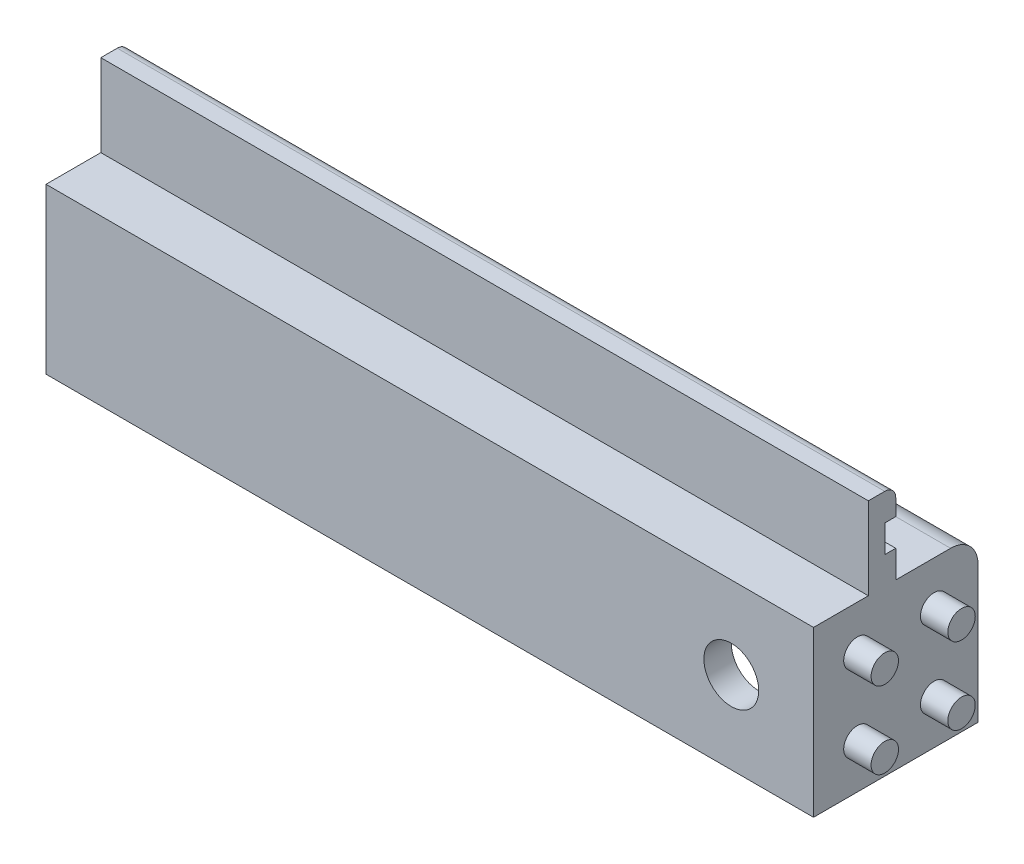
ISO-10303-21;
HEADER;
FILE_DESCRIPTION(('STEP AP214'),'2;1');
FILE_NAME('part.step','',(''),(''),'','','');
FILE_SCHEMA(('AUTOMOTIVE_DESIGN { 1 0 10303 214 1 1 1 1 }'));
ENDSEC;
DATA;
#1=APPLICATION_CONTEXT('core data for automotive mechanical design processes');
#2=APPLICATION_PROTOCOL_DEFINITION('international standard','automotive_design',2000,#1);
#3=PRODUCT_CONTEXT('',#1,'mechanical');
#4=PRODUCT('Part','Part','',(#3));
#5=PRODUCT_RELATED_PRODUCT_CATEGORY('part','',(#4));
#6=PRODUCT_DEFINITION_FORMATION('','',#4);
#7=PRODUCT_DEFINITION_CONTEXT('part definition',#1,'design');
#8=PRODUCT_DEFINITION('design','',#6,#7);
#9=PRODUCT_DEFINITION_SHAPE('','',#8);
#10=(LENGTH_UNIT() NAMED_UNIT(*) SI_UNIT(.MILLI.,.METRE.));
#11=(NAMED_UNIT(*) PLANE_ANGLE_UNIT() SI_UNIT($,.RADIAN.));
#12=(NAMED_UNIT(*) SI_UNIT($,.STERADIAN.) SOLID_ANGLE_UNIT());
#13=UNCERTAINTY_MEASURE_WITH_UNIT(LENGTH_MEASURE(1.E-05),#10,'distance_accuracy_value','');
#14=(GEOMETRIC_REPRESENTATION_CONTEXT(3) GLOBAL_UNCERTAINTY_ASSIGNED_CONTEXT((#13)) GLOBAL_UNIT_ASSIGNED_CONTEXT((#10,
#11,#12)) REPRESENTATION_CONTEXT('',''));
#15=CARTESIAN_POINT('',(0.,0.,0.));
#16=DIRECTION('',(0.,0.,1.));
#17=DIRECTION('',(1.,0.,0.));
#18=AXIS2_PLACEMENT_3D('',#15,#16,#17);
#19=CARTESIAN_POINT('',(0.,30.,0.));
#20=DIRECTION('',(0.,1.,0.));
#21=DIRECTION('',(0.,0.,1.));
#22=AXIS2_PLACEMENT_3D('',#19,#20,#21);
#23=PLANE('',#22);
#24=DIRECTION('',(0.,0.,-1.));
#25=VECTOR('',#24,1.);
#26=CARTESIAN_POINT('',(140.,30.,0.));
#27=LINE('',#26,#25);
#28=CARTESIAN_POINT('',(140.,30.,-15.));
#29=VERTEX_POINT('',#28);
#30=CARTESIAN_POINT('',(140.,30.,-25.));
#31=VERTEX_POINT('',#30);
#32=EDGE_CURVE('E328',#29,#31,#27,.T.);
#33=ORIENTED_EDGE('',*,*,#32,.T.);
#34=DIRECTION('',(-1.,0.,0.));
#35=VECTOR('',#34,1.);
#36=CARTESIAN_POINT('',(0.,30.,-25.));
#37=LINE('',#36,#35);
#38=CARTESIAN_POINT('',(0.,30.,-25.));
#39=VERTEX_POINT('',#38);
#40=EDGE_CURVE('E373',#31,#39,#37,.T.);
#41=ORIENTED_EDGE('',*,*,#40,.T.);
#42=DIRECTION('',(0.,0.,1.));
#43=VECTOR('',#42,1.);
#44=CARTESIAN_POINT('',(0.,30.,-30.));
#45=LINE('',#44,#43);
#46=CARTESIAN_POINT('',(0.,30.,-15.));
#47=VERTEX_POINT('',#46);
#48=EDGE_CURVE('E323',#39,#47,#45,.T.);
#49=ORIENTED_EDGE('',*,*,#48,.T.);
#50=DIRECTION('',(-1.,0.,0.));
#51=VECTOR('',#50,1.);
#52=CARTESIAN_POINT('',(0.,30.,-15.));
#53=LINE('',#52,#51);
#54=EDGE_CURVE('E220',#29,#47,#53,.T.);
#55=ORIENTED_EDGE('',*,*,#54,.F.);
#56=EDGE_LOOP('',(#33,#41,#49,#55));
#57=FACE_BOUND('',#56,.T.);
#58=ADVANCED_FACE('F33',(#57),#23,.T.);
#59=CARTESIAN_POINT('',(0.,30.,-5.));
#60=DIRECTION('',(0.,0.,-1.));
#61=DIRECTION('',(-1.,0.,0.));
#62=AXIS2_PLACEMENT_3D('',#59,#60,#61);
#63=PLANE('',#62);
#64=DIRECTION('',(1.,0.,0.));
#65=VECTOR('',#64,1.);
#66=CARTESIAN_POINT('',(0.,25.,-5.));
#67=LINE('',#66,#65);
#68=CARTESIAN_POINT('',(5.,25.,-5.));
#69=VERTEX_POINT('',#68);
#70=CARTESIAN_POINT('',(50.,25.,-5.));
#71=VERTEX_POINT('',#70);
#72=EDGE_CURVE('E302',#69,#71,#67,.T.);
#73=ORIENTED_EDGE('',*,*,#72,.T.);
#74=DIRECTION('',(0.,1.,0.));
#75=VECTOR('',#74,1.);
#76=CARTESIAN_POINT('',(50.,0.,-5.));
#77=LINE('',#76,#75);
#78=CARTESIAN_POINT('',(50.,0.,-5.));
#79=VERTEX_POINT('',#78);
#80=EDGE_CURVE('E281',#79,#71,#77,.T.);
#81=ORIENTED_EDGE('',*,*,#80,.F.);
#82=DIRECTION('',(1.,0.,0.));
#83=VECTOR('',#82,1.);
#84=CARTESIAN_POINT('',(0.,0.,-5.));
#85=LINE('',#84,#83);
#86=CARTESIAN_POINT('',(5.,0.,-5.));
#87=VERTEX_POINT('',#86);
#88=EDGE_CURVE('E320',#87,#79,#85,.T.);
#89=ORIENTED_EDGE('',*,*,#88,.F.);
#90=DIRECTION('',(0.,-1.,0.));
#91=VECTOR('',#90,1.);
#92=CARTESIAN_POINT('',(5.,30.,-5.));
#93=LINE('',#92,#91);
#94=EDGE_CURVE('E285',#69,#87,#93,.T.);
#95=ORIENTED_EDGE('',*,*,#94,.F.);
#96=EDGE_LOOP('',(#73,#81,#89,#95));
#97=FACE_BOUND('',#96,.T.);
#98=ADVANCED_FACE('F399',(#97),#63,.T.);
#99=CARTESIAN_POINT('',(125.,15.,-5.));
#100=DIRECTION('',(0.,0.,-1.));
#101=DIRECTION('',(-1.,0.,0.));
#102=AXIS2_PLACEMENT_3D('',#99,#100,#101);
#103=CIRCLE('',#102,4.99999999999999);
#104=CARTESIAN_POINT('',(120.,15.,-5.));
#105=VERTEX_POINT('',#104);
#106=EDGE_CURVE('E246',#105,#105,#103,.T.);
#107=ORIENTED_EDGE('',*,*,#106,.F.);
#108=EDGE_LOOP('',(#107));
#109=FACE_BOUND('',#108,.T.);
#110=CARTESIAN_POINT('',(55.,0.,-5.));
#111=VERTEX_POINT('',#110);
#112=CARTESIAN_POINT('',(135.,0.,-5.));
#113=VERTEX_POINT('',#112);
#114=EDGE_CURVE('E313',#111,#113,#85,.T.);
#115=ORIENTED_EDGE('',*,*,#114,.F.);
#116=DIRECTION('',(0.,1.,0.));
#117=VECTOR('',#116,1.);
#118=CARTESIAN_POINT('',(55.,0.,-5.));
#119=LINE('',#118,#117);
#120=CARTESIAN_POINT('',(55.,25.,-5.));
#121=VERTEX_POINT('',#120);
#122=EDGE_CURVE('E269',#111,#121,#119,.T.);
#123=ORIENTED_EDGE('',*,*,#122,.T.);
#124=CARTESIAN_POINT('',(135.,25.,-5.));
#125=VERTEX_POINT('',#124);
#126=EDGE_CURVE('E293',#121,#125,#67,.T.);
#127=ORIENTED_EDGE('',*,*,#126,.T.);
#128=DIRECTION('',(0.,-1.,0.));
#129=VECTOR('',#128,1.);
#130=CARTESIAN_POINT('',(135.,30.,-5.));
#131=LINE('',#130,#129);
#132=EDGE_CURVE('E289',#125,#113,#131,.T.);
#133=ORIENTED_EDGE('',*,*,#132,.T.);
#134=EDGE_LOOP('',(#115,#123,#127,#133));
#135=FACE_BOUND('',#134,.T.);
#136=ADVANCED_FACE('F407',(#109,#135),#63,.T.);
#137=CARTESIAN_POINT('',(140.,30.,-25.));
#138=DIRECTION('',(0.,0.,1.));
#139=DIRECTION('',(1.,0.,0.));
#140=AXIS2_PLACEMENT_3D('',#137,#138,#139);
#141=PLANE('',#140);
#142=DIRECTION('',(-1.,0.,0.));
#143=VECTOR('',#142,1.);
#144=CARTESIAN_POINT('',(140.,0.,-25.));
#145=LINE('',#144,#143);
#146=CARTESIAN_POINT('',(50.,0.,-25.));
#147=VERTEX_POINT('',#146);
#148=CARTESIAN_POINT('',(5.,0.,-25.));
#149=VERTEX_POINT('',#148);
#150=EDGE_CURVE('E316',#147,#149,#145,.T.);
#151=ORIENTED_EDGE('',*,*,#150,.F.);
#152=DIRECTION('',(0.,1.,0.));
#153=VECTOR('',#152,1.);
#154=CARTESIAN_POINT('',(50.,0.,-25.));
#155=LINE('',#154,#153);
#156=CARTESIAN_POINT('',(50.,25.,-25.));
#157=VERTEX_POINT('',#156);
#158=EDGE_CURVE('E279',#147,#157,#155,.T.);
#159=ORIENTED_EDGE('',*,*,#158,.T.);
#160=DIRECTION('',(-1.,0.,0.));
#161=VECTOR('',#160,1.);
#162=CARTESIAN_POINT('',(140.,25.,-25.));
#163=LINE('',#162,#161);
#164=CARTESIAN_POINT('',(5.,25.,-25.));
#165=VERTEX_POINT('',#164);
#166=EDGE_CURVE('E308',#157,#165,#163,.T.);
#167=ORIENTED_EDGE('',*,*,#166,.T.);
#168=DIRECTION('',(0.,-1.,0.));
#169=VECTOR('',#168,1.);
#170=CARTESIAN_POINT('',(5.,30.,-25.));
#171=LINE('',#170,#169);
#172=EDGE_CURVE('E295',#165,#149,#171,.T.);
#173=ORIENTED_EDGE('',*,*,#172,.T.);
#174=EDGE_LOOP('',(#151,#159,#167,#173));
#175=FACE_BOUND('',#174,.T.);
#176=ADVANCED_FACE('F540',(#175),#141,.T.);
#177=CARTESIAN_POINT('',(125.,15.,-25.));
#178=DIRECTION('',(0.,0.,1.));
#179=DIRECTION('',(1.,0.,0.));
#180=AXIS2_PLACEMENT_3D('',#177,#178,#179);
#181=CIRCLE('',#180,4.99999999999999);
#182=CARTESIAN_POINT('',(130.,15.,-25.));
#183=VERTEX_POINT('',#182);
#184=EDGE_CURVE('E243',#183,#183,#181,.T.);
#185=ORIENTED_EDGE('',*,*,#184,.F.);
#186=EDGE_LOOP('',(#185));
#187=FACE_BOUND('',#186,.T.);
#188=CARTESIAN_POINT('',(135.,25.,-25.));
#189=VERTEX_POINT('',#188);
#190=CARTESIAN_POINT('',(55.,25.,-25.));
#191=VERTEX_POINT('',#190);
#192=EDGE_CURVE('E299',#189,#191,#163,.T.);
#193=ORIENTED_EDGE('',*,*,#192,.T.);
#194=DIRECTION('',(0.,1.,0.));
#195=VECTOR('',#194,1.);
#196=CARTESIAN_POINT('',(55.,0.,-25.));
#197=LINE('',#196,#195);
#198=CARTESIAN_POINT('',(55.,0.,-25.));
#199=VERTEX_POINT('',#198);
#200=EDGE_CURVE('E276',#199,#191,#197,.T.);
#201=ORIENTED_EDGE('',*,*,#200,.F.);
#202=CARTESIAN_POINT('',(135.,0.,-25.));
#203=VERTEX_POINT('',#202);
#204=EDGE_CURVE('E294',#203,#199,#145,.T.);
#205=ORIENTED_EDGE('',*,*,#204,.F.);
#206=DIRECTION('',(0.,-1.,0.));
#207=VECTOR('',#206,1.);
#208=CARTESIAN_POINT('',(135.,30.,-25.));
#209=LINE('',#208,#207);
#210=EDGE_CURVE('E298',#189,#203,#209,.T.);
#211=ORIENTED_EDGE('',*,*,#210,.F.);
#212=EDGE_LOOP('',(#193,#201,#205,#211));
#213=FACE_BOUND('',#212,.T.);
#214=ADVANCED_FACE('F542',(#187,#213),#141,.T.);
#215=CARTESIAN_POINT('',(0.,25.,0.));
#216=DIRECTION('',(0.,1.,0.));
#217=DIRECTION('',(0.,0.,1.));
#218=AXIS2_PLACEMENT_3D('',#215,#216,#217);
#219=PLANE('',#218);
#220=DIRECTION('',(0.,0.,-1.));
#221=VECTOR('',#220,1.);
#222=CARTESIAN_POINT('',(50.,25.,-5.));
#223=LINE('',#222,#221);
#224=EDGE_CURVE('E261',#71,#157,#223,.T.);
#225=ORIENTED_EDGE('',*,*,#224,.F.);
#226=ORIENTED_EDGE('',*,*,#72,.F.);
#227=DIRECTION('',(0.,0.,1.));
#228=VECTOR('',#227,1.);
#229=CARTESIAN_POINT('',(5.,25.,-30.));
#230=LINE('',#229,#228);
#231=EDGE_CURVE('E290',#165,#69,#230,.T.);
#232=ORIENTED_EDGE('',*,*,#231,.F.);
#233=ORIENTED_EDGE('',*,*,#166,.F.);
#234=EDGE_LOOP('',(#225,#226,#232,#233));
#235=FACE_BOUND('',#234,.T.);
#236=ADVANCED_FACE('F544',(#235),#219,.F.);
#237=DIRECTION('',(0.,0.,1.));
#238=VECTOR('',#237,1.);
#239=CARTESIAN_POINT('',(55.,25.,-25.));
#240=LINE('',#239,#238);
#241=EDGE_CURVE('E266',#191,#121,#240,.T.);
#242=ORIENTED_EDGE('',*,*,#241,.F.);
#243=ORIENTED_EDGE('',*,*,#192,.F.);
#244=DIRECTION('',(0.,0.,-1.));
#245=VECTOR('',#244,1.);
#246=CARTESIAN_POINT('',(135.,25.,0.));
#247=LINE('',#246,#245);
#248=EDGE_CURVE('E305',#125,#189,#247,.T.);
#249=ORIENTED_EDGE('',*,*,#248,.F.);
#250=ORIENTED_EDGE('',*,*,#126,.F.);
#251=EDGE_LOOP('',(#242,#243,#249,#250));
#252=FACE_BOUND('',#251,.T.);
#253=ADVANCED_FACE('F456',(#252),#219,.F.);
#254=CARTESIAN_POINT('',(0.,30.,-30.));
#255=DIRECTION('',(1.,0.,0.));
#256=DIRECTION('',(0.,0.,-1.));
#257=AXIS2_PLACEMENT_3D('',#254,#255,#256);
#258=PLANE('',#257);
#259=CARTESIAN_POINT('',(0.,15.,-15.));
#260=DIRECTION('',(-1.,0.,0.));
#261=DIRECTION('',(0.,0.,1.));
#262=AXIS2_PLACEMENT_3D('',#259,#260,#261);
#263=CIRCLE('',#262,5.2);
#264=CARTESIAN_POINT('',(0.,15.,-9.8));
#265=VERTEX_POINT('',#264);
#266=EDGE_CURVE('E805',#265,#265,#263,.T.);
#267=ORIENTED_EDGE('',*,*,#266,.F.);
#268=EDGE_LOOP('',(#267));
#269=FACE_BOUND('',#268,.T.);
#270=ORIENTED_EDGE('',*,*,#48,.F.);
#271=CARTESIAN_POINT('',(0.,25.,-25.));
#272=DIRECTION('',(1.,0.,0.));
#273=DIRECTION('',(0.,0.,-1.));
#274=AXIS2_PLACEMENT_3D('',#271,#272,#273);
#275=CIRCLE('',#274,5.);
#276=CARTESIAN_POINT('',(0.,25.,-30.));
#277=VERTEX_POINT('',#276);
#278=EDGE_CURVE('E55',#39,#277,#275,.F.);
#279=ORIENTED_EDGE('',*,*,#278,.T.);
#280=DIRECTION('',(0.,-1.,0.));
#281=VECTOR('',#280,1.);
#282=CARTESIAN_POINT('',(0.,30.,-30.));
#283=LINE('',#282,#281);
#284=CARTESIAN_POINT('',(0.,0.,-30.));
#285=VERTEX_POINT('',#284);
#286=EDGE_CURVE('E331',#277,#285,#283,.T.);
#287=ORIENTED_EDGE('',*,*,#286,.T.);
#288=DIRECTION('',(0.,0.,1.));
#289=VECTOR('',#288,1.);
#290=CARTESIAN_POINT('',(0.,0.,-30.));
#291=LINE('',#290,#289);
#292=CARTESIAN_POINT('',(0.,0.,0.));
#293=VERTEX_POINT('',#292);
#294=EDGE_CURVE('E288',#285,#293,#291,.T.);
#295=ORIENTED_EDGE('',*,*,#294,.T.);
#296=DIRECTION('',(0.,-1.,0.));
#297=VECTOR('',#296,1.);
#298=CARTESIAN_POINT('',(0.,30.,0.));
#299=LINE('',#298,#297);
#300=CARTESIAN_POINT('',(0.,30.,0.));
#301=VERTEX_POINT('',#300);
#302=EDGE_CURVE('E348',#301,#293,#299,.T.);
#303=ORIENTED_EDGE('',*,*,#302,.F.);
#304=CARTESIAN_POINT('',(0.,30.,-10.));
#305=VERTEX_POINT('',#304);
#306=EDGE_CURVE('E326',#305,#301,#45,.T.);
#307=ORIENTED_EDGE('',*,*,#306,.F.);
#308=DIRECTION('',(0.,-1.,0.));
#309=VECTOR('',#308,1.);
#310=CARTESIAN_POINT('',(0.,45.,-10.));
#311=LINE('',#310,#309);
#312=CARTESIAN_POINT('',(0.,45.,-10.));
#313=VERTEX_POINT('',#312);
#314=EDGE_CURVE('E236',#313,#305,#311,.T.);
#315=ORIENTED_EDGE('',*,*,#314,.F.);
#316=DIRECTION('',(0.,0.,1.));
#317=VECTOR('',#316,1.);
#318=CARTESIAN_POINT('',(0.,45.,-15.));
#319=LINE('',#318,#317);
#320=CARTESIAN_POINT('',(0.,45.,-13.));
#321=VERTEX_POINT('',#320);
#322=EDGE_CURVE('E217',#321,#313,#319,.T.);
#323=ORIENTED_EDGE('',*,*,#322,.F.);
#324=CARTESIAN_POINT('',(0.,43.,-13.));
#325=DIRECTION('',(1.,0.,0.));
#326=DIRECTION('',(0.,0.,-1.));
#327=AXIS2_PLACEMENT_3D('',#324,#325,#326);
#328=CIRCLE('',#327,2.);
#329=CARTESIAN_POINT('',(0.,43.,-15.));
#330=VERTEX_POINT('',#329);
#331=EDGE_CURVE('E368',#321,#330,#328,.F.);
#332=ORIENTED_EDGE('',*,*,#331,.T.);
#333=DIRECTION('',(0.,-1.,0.));
#334=VECTOR('',#333,1.);
#335=CARTESIAN_POINT('',(0.,45.,-15.));
#336=LINE('',#335,#334);
#337=EDGE_CURVE('E225',#330,#47,#336,.T.);
#338=ORIENTED_EDGE('',*,*,#337,.T.);
#339=EDGE_LOOP('',(#270,#279,#287,#295,#303,#307,#315,#323,#332,#338));
#340=FACE_BOUND('',#339,.T.);
#341=ADVANCED_FACE('F387',(#269,#340),#258,.F.);
#342=CARTESIAN_POINT('',(0.,30.,0.));
#343=DIRECTION('',(0.,0.,-1.));
#344=DIRECTION('',(-1.,0.,0.));
#345=AXIS2_PLACEMENT_3D('',#342,#343,#344);
#346=PLANE('',#345);
#347=CARTESIAN_POINT('',(125.,15.,0.));
#348=DIRECTION('',(0.,0.,-1.));
#349=DIRECTION('',(-1.,0.,0.));
#350=AXIS2_PLACEMENT_3D('',#347,#348,#349);
#351=CIRCLE('',#350,4.99999999999999);
#352=CARTESIAN_POINT('',(120.,15.,0.));
#353=VERTEX_POINT('',#352);
#354=EDGE_CURVE('E239',#353,#353,#351,.T.);
#355=ORIENTED_EDGE('',*,*,#354,.T.);
#356=EDGE_LOOP('',(#355));
#357=FACE_BOUND('',#356,.T.);
#358=DIRECTION('',(1.,0.,0.));
#359=VECTOR('',#358,1.);
#360=CARTESIAN_POINT('',(0.,0.,0.));
#361=LINE('',#360,#359);
#362=CARTESIAN_POINT('',(140.,0.,0.));
#363=VERTEX_POINT('',#362);
#364=EDGE_CURVE('E334',#293,#363,#361,.T.);
#365=ORIENTED_EDGE('',*,*,#364,.T.);
#366=DIRECTION('',(0.,-1.,0.));
#367=VECTOR('',#366,1.);
#368=CARTESIAN_POINT('',(140.,30.,0.));
#369=LINE('',#368,#367);
#370=CARTESIAN_POINT('',(140.,30.,0.));
#371=VERTEX_POINT('',#370);
#372=EDGE_CURVE('E345',#371,#363,#369,.T.);
#373=ORIENTED_EDGE('',*,*,#372,.F.);
#374=DIRECTION('',(1.,0.,0.));
#375=VECTOR('',#374,1.);
#376=CARTESIAN_POINT('',(0.,30.,0.));
#377=LINE('',#376,#375);
#378=EDGE_CURVE('E325',#301,#371,#377,.T.);
#379=ORIENTED_EDGE('',*,*,#378,.F.);
#380=ORIENTED_EDGE('',*,*,#302,.T.);
#381=EDGE_LOOP('',(#365,#373,#379,#380));
#382=FACE_BOUND('',#381,.T.);
#383=ADVANCED_FACE('F446',(#357,#382),#346,.F.);
#384=CARTESIAN_POINT('',(140.,30.,0.));
#385=DIRECTION('',(-1.,0.,0.));
#386=DIRECTION('',(0.,0.,1.));
#387=AXIS2_PLACEMENT_3D('',#384,#385,#386);
#388=PLANE('',#387);
#389=DIRECTION('',(0.,-1.,0.));
#390=VECTOR('',#389,1.);
#391=CARTESIAN_POINT('',(140.,30.,-30.));
#392=LINE('',#391,#390);
#393=CARTESIAN_POINT('',(140.,25.,-30.));
#394=VERTEX_POINT('',#393);
#395=CARTESIAN_POINT('',(140.,0.,-30.));
#396=VERTEX_POINT('',#395);
#397=EDGE_CURVE('E343',#394,#396,#392,.T.);
#398=ORIENTED_EDGE('',*,*,#397,.F.);
#399=CARTESIAN_POINT('',(140.,25.,-25.));
#400=DIRECTION('',(-1.,0.,0.));
#401=DIRECTION('',(0.,0.,1.));
#402=AXIS2_PLACEMENT_3D('',#399,#400,#401);
#403=CIRCLE('',#402,5.);
#404=EDGE_CURVE('E11',#394,#31,#403,.F.);
#405=ORIENTED_EDGE('',*,*,#404,.T.);
#406=ORIENTED_EDGE('',*,*,#32,.F.);
#407=DIRECTION('',(0.,-1.,0.));
#408=VECTOR('',#407,1.);
#409=CARTESIAN_POINT('',(140.,45.,-15.));
#410=LINE('',#409,#408);
#411=CARTESIAN_POINT('',(140.,35.,-15.));
#412=VERTEX_POINT('',#411);
#413=EDGE_CURVE('E192',#412,#29,#410,.T.);
#414=ORIENTED_EDGE('',*,*,#413,.F.);
#415=DIRECTION('',(0.,0.,1.));
#416=VECTOR('',#415,1.);
#417=CARTESIAN_POINT('',(140.,35.,-15.));
#418=LINE('',#417,#416);
#419=CARTESIAN_POINT('',(140.,35.,-13.));
#420=VERTEX_POINT('',#419);
#421=EDGE_CURVE('E229',#412,#420,#418,.T.);
#422=ORIENTED_EDGE('',*,*,#421,.T.);
#423=DIRECTION('',(0.,1.,0.));
#424=VECTOR('',#423,1.);
#425=CARTESIAN_POINT('',(140.,40.,-13.));
#426=LINE('',#425,#424);
#427=CARTESIAN_POINT('',(140.,40.,-13.));
#428=VERTEX_POINT('',#427);
#429=EDGE_CURVE('E208',#420,#428,#426,.T.);
#430=ORIENTED_EDGE('',*,*,#429,.T.);
#431=DIRECTION('',(0.,0.,1.));
#432=VECTOR('',#431,1.);
#433=CARTESIAN_POINT('',(140.,40.,-15.));
#434=LINE('',#433,#432);
#435=CARTESIAN_POINT('',(140.,40.,-15.));
#436=VERTEX_POINT('',#435);
#437=EDGE_CURVE('E198',#436,#428,#434,.T.);
#438=ORIENTED_EDGE('',*,*,#437,.F.);
#439=CARTESIAN_POINT('',(140.,43.,-15.));
#440=VERTEX_POINT('',#439);
#441=EDGE_CURVE('E180',#440,#436,#410,.T.);
#442=ORIENTED_EDGE('',*,*,#441,.F.);
#443=CARTESIAN_POINT('',(140.,43.,-13.));
#444=DIRECTION('',(-1.,0.,0.));
#445=DIRECTION('',(0.,0.,1.));
#446=AXIS2_PLACEMENT_3D('',#443,#444,#445);
#447=CIRCLE('',#446,2.);
#448=CARTESIAN_POINT('',(140.,45.,-13.));
#449=VERTEX_POINT('',#448);
#450=EDGE_CURVE('E371',#440,#449,#447,.F.);
#451=ORIENTED_EDGE('',*,*,#450,.T.);
#452=DIRECTION('',(0.,0.,-1.));
#453=VECTOR('',#452,1.);
#454=CARTESIAN_POINT('',(140.,45.,-15.));
#455=LINE('',#454,#453);
#456=CARTESIAN_POINT('',(140.,45.,-10.));
#457=VERTEX_POINT('',#456);
#458=EDGE_CURVE('E222',#457,#449,#455,.T.);
#459=ORIENTED_EDGE('',*,*,#458,.F.);
#460=DIRECTION('',(0.,-1.,0.));
#461=VECTOR('',#460,1.);
#462=CARTESIAN_POINT('',(140.,45.,-10.));
#463=LINE('',#462,#461);
#464=CARTESIAN_POINT('',(140.,30.,-10.));
#465=VERTEX_POINT('',#464);
#466=EDGE_CURVE('E191',#457,#465,#463,.T.);
#467=ORIENTED_EDGE('',*,*,#466,.T.);
#468=EDGE_CURVE('E329',#371,#465,#27,.T.);
#469=ORIENTED_EDGE('',*,*,#468,.F.);
#470=ORIENTED_EDGE('',*,*,#372,.T.);
#471=DIRECTION('',(0.,0.,-1.));
#472=VECTOR('',#471,1.);
#473=CARTESIAN_POINT('',(140.,0.,0.));
#474=LINE('',#473,#472);
#475=EDGE_CURVE('E336',#363,#396,#474,.T.);
#476=ORIENTED_EDGE('',*,*,#475,.T.);
#477=EDGE_LOOP('',(#398,#405,#406,#414,#422,#430,#438,#442,#451,#459,#467,#469,#470,#476));
#478=FACE_BOUND('',#477,.T.);
#479=CARTESIAN_POINT('',(140.,8.,-22.));
#480=DIRECTION('',(-1.,0.,0.));
#481=DIRECTION('',(0.,0.,1.));
#482=AXIS2_PLACEMENT_3D('',#479,#480,#481);
#483=CIRCLE('',#482,2.5);
#484=CARTESIAN_POINT('',(140.,8.,-19.5));
#485=VERTEX_POINT('',#484);
#486=EDGE_CURVE('E360',#485,#485,#483,.F.);
#487=ORIENTED_EDGE('',*,*,#486,.F.);
#488=EDGE_LOOP('',(#487));
#489=FACE_BOUND('',#488,.T.);
#490=CARTESIAN_POINT('',(140.,8.,-8.));
#491=DIRECTION('',(-1.,0.,0.));
#492=DIRECTION('',(0.,0.,1.));
#493=AXIS2_PLACEMENT_3D('',#490,#491,#492);
#494=CIRCLE('',#493,2.5);
#495=CARTESIAN_POINT('',(140.,8.,-5.5));
#496=VERTEX_POINT('',#495);
#497=EDGE_CURVE('E357',#496,#496,#494,.F.);
#498=ORIENTED_EDGE('',*,*,#497,.F.);
#499=EDGE_LOOP('',(#498));
#500=FACE_BOUND('',#499,.T.);
#501=CARTESIAN_POINT('',(140.,22.,-22.));
#502=DIRECTION('',(-1.,0.,0.));
#503=DIRECTION('',(0.,0.,1.));
#504=AXIS2_PLACEMENT_3D('',#501,#502,#503);
#505=CIRCLE('',#504,2.5);
#506=CARTESIAN_POINT('',(140.,22.,-19.5));
#507=VERTEX_POINT('',#506);
#508=EDGE_CURVE('E354',#507,#507,#505,.F.);
#509=ORIENTED_EDGE('',*,*,#508,.F.);
#510=EDGE_LOOP('',(#509));
#511=FACE_BOUND('',#510,.T.);
#512=CARTESIAN_POINT('',(140.,22.,-8.));
#513=DIRECTION('',(-1.,0.,0.));
#514=DIRECTION('',(0.,0.,1.));
#515=AXIS2_PLACEMENT_3D('',#512,#513,#514);
#516=CIRCLE('',#515,2.5);
#517=CARTESIAN_POINT('',(140.,22.,-5.5));
#518=VERTEX_POINT('',#517);
#519=EDGE_CURVE('E351',#518,#518,#516,.F.);
#520=ORIENTED_EDGE('',*,*,#519,.F.);
#521=EDGE_LOOP('',(#520));
#522=FACE_BOUND('',#521,.T.);
#523=ADVANCED_FACE('F205',(#478,#489,#500,#511,#522),#388,.F.);
#524=CARTESIAN_POINT('',(140.,30.,-30.));
#525=DIRECTION('',(0.,0.,1.));
#526=DIRECTION('',(1.,0.,0.));
#527=AXIS2_PLACEMENT_3D('',#524,#525,#526);
#528=PLANE('',#527);
#529=CARTESIAN_POINT('',(125.,15.,-30.));
#530=DIRECTION('',(0.,0.,1.));
#531=DIRECTION('',(1.,0.,0.));
#532=AXIS2_PLACEMENT_3D('',#529,#530,#531);
#533=CIRCLE('',#532,4.99999999999999);
#534=CARTESIAN_POINT('',(130.,15.,-30.));
#535=VERTEX_POINT('',#534);
#536=EDGE_CURVE('E242',#535,#535,#533,.T.);
#537=ORIENTED_EDGE('',*,*,#536,.T.);
#538=EDGE_LOOP('',(#537));
#539=FACE_BOUND('',#538,.T.);
#540=ORIENTED_EDGE('',*,*,#286,.F.);
#541=DIRECTION('',(-1.,0.,0.));
#542=VECTOR('',#541,1.);
#543=CARTESIAN_POINT('',(140.,25.,-30.));
#544=LINE('',#543,#542);
#545=EDGE_CURVE('E41',#277,#394,#544,.F.);
#546=ORIENTED_EDGE('',*,*,#545,.T.);
#547=ORIENTED_EDGE('',*,*,#397,.T.);
#548=DIRECTION('',(-1.,0.,0.));
#549=VECTOR('',#548,1.);
#550=CARTESIAN_POINT('',(140.,0.,-30.));
#551=LINE('',#550,#549);
#552=EDGE_CURVE('E339',#396,#285,#551,.T.);
#553=ORIENTED_EDGE('',*,*,#552,.T.);
#554=EDGE_LOOP('',(#540,#546,#547,#553));
#555=FACE_BOUND('',#554,.T.);
#556=ADVANCED_FACE('F414',(#539,#555),#528,.F.);
#557=DIRECTION('',(1.,0.,0.));
#558=VECTOR('',#557,1.);
#559=CARTESIAN_POINT('',(0.,30.,-10.));
#560=LINE('',#559,#558);
#561=EDGE_CURVE('E226',#305,#465,#560,.T.);
#562=ORIENTED_EDGE('',*,*,#561,.F.);
#563=ORIENTED_EDGE('',*,*,#306,.T.);
#564=ORIENTED_EDGE('',*,*,#378,.T.);
#565=ORIENTED_EDGE('',*,*,#468,.T.);
#566=EDGE_LOOP('',(#562,#563,#564,#565));
#567=FACE_BOUND('',#566,.T.);
#568=ADVANCED_FACE('F401',(#567),#23,.T.);
#569=CARTESIAN_POINT('',(0.,0.,0.));
#570=DIRECTION('',(0.,1.,0.));
#571=DIRECTION('',(0.,0.,1.));
#572=AXIS2_PLACEMENT_3D('',#569,#570,#571);
#573=PLANE('',#572);
#574=ORIENTED_EDGE('',*,*,#88,.T.);
#575=DIRECTION('',(0.,0.,-1.));
#576=VECTOR('',#575,1.);
#577=CARTESIAN_POINT('',(50.,0.,-5.));
#578=LINE('',#577,#576);
#579=EDGE_CURVE('E262',#79,#147,#578,.T.);
#580=ORIENTED_EDGE('',*,*,#579,.T.);
#581=ORIENTED_EDGE('',*,*,#150,.T.);
#582=DIRECTION('',(0.,0.,1.));
#583=VECTOR('',#582,1.);
#584=CARTESIAN_POINT('',(5.,0.,-30.));
#585=LINE('',#584,#583);
#586=EDGE_CURVE('E284',#149,#87,#585,.T.);
#587=ORIENTED_EDGE('',*,*,#586,.T.);
#588=EDGE_LOOP('',(#574,#580,#581,#587));
#589=FACE_BOUND('',#588,.T.);
#590=ORIENTED_EDGE('',*,*,#204,.T.);
#591=DIRECTION('',(0.,0.,1.));
#592=VECTOR('',#591,1.);
#593=CARTESIAN_POINT('',(55.,0.,-25.));
#594=LINE('',#593,#592);
#595=EDGE_CURVE('E265',#199,#111,#594,.T.);
#596=ORIENTED_EDGE('',*,*,#595,.T.);
#597=ORIENTED_EDGE('',*,*,#114,.T.);
#598=DIRECTION('',(0.,0.,-1.));
#599=VECTOR('',#598,1.);
#600=CARTESIAN_POINT('',(135.,0.,0.));
#601=LINE('',#600,#599);
#602=EDGE_CURVE('E317',#113,#203,#601,.T.);
#603=ORIENTED_EDGE('',*,*,#602,.T.);
#604=EDGE_LOOP('',(#590,#596,#597,#603));
#605=FACE_BOUND('',#604,.T.);
#606=ORIENTED_EDGE('',*,*,#294,.F.);
#607=ORIENTED_EDGE('',*,*,#552,.F.);
#608=ORIENTED_EDGE('',*,*,#475,.F.);
#609=ORIENTED_EDGE('',*,*,#364,.F.);
#610=EDGE_LOOP('',(#606,#607,#608,#609));
#611=FACE_BOUND('',#610,.T.);
#612=ADVANCED_FACE('F413',(#589,#605,#611),#573,.F.);
#613=CARTESIAN_POINT('',(5.,30.,-30.));
#614=DIRECTION('',(1.,0.,0.));
#615=DIRECTION('',(0.,0.,-1.));
#616=AXIS2_PLACEMENT_3D('',#613,#614,#615);
#617=PLANE('',#616);
#618=CARTESIAN_POINT('',(5.,15.,-15.));
#619=DIRECTION('',(1.,0.,0.));
#620=DIRECTION('',(0.,0.,-1.));
#621=AXIS2_PLACEMENT_3D('',#618,#619,#620);
#622=CIRCLE('',#621,2.75);
#623=CARTESIAN_POINT('',(5.,15.,-17.75));
#624=VERTEX_POINT('',#623);
#625=EDGE_CURVE('E374',#624,#624,#622,.T.);
#626=ORIENTED_EDGE('',*,*,#625,.F.);
#627=EDGE_LOOP('',(#626));
#628=FACE_BOUND('',#627,.T.);
#629=ORIENTED_EDGE('',*,*,#586,.F.);
#630=ORIENTED_EDGE('',*,*,#172,.F.);
#631=ORIENTED_EDGE('',*,*,#231,.T.);
#632=ORIENTED_EDGE('',*,*,#94,.T.);
#633=EDGE_LOOP('',(#629,#630,#631,#632));
#634=FACE_BOUND('',#633,.T.);
#635=ADVANCED_FACE('F420',(#628,#634),#617,.T.);
#636=CARTESIAN_POINT('',(135.,30.,0.));
#637=DIRECTION('',(-1.,0.,0.));
#638=DIRECTION('',(0.,0.,1.));
#639=AXIS2_PLACEMENT_3D('',#636,#637,#638);
#640=PLANE('',#639);
#641=ORIENTED_EDGE('',*,*,#602,.F.);
#642=ORIENTED_EDGE('',*,*,#132,.F.);
#643=ORIENTED_EDGE('',*,*,#248,.T.);
#644=ORIENTED_EDGE('',*,*,#210,.T.);
#645=EDGE_LOOP('',(#641,#642,#643,#644));
#646=FACE_BOUND('',#645,.T.);
#647=ADVANCED_FACE('F532',(#646),#640,.T.);
#648=CARTESIAN_POINT('',(50.,0.,-5.));
#649=DIRECTION('',(1.,0.,0.));
#650=DIRECTION('',(0.,0.,-1.));
#651=AXIS2_PLACEMENT_3D('',#648,#649,#650);
#652=PLANE('',#651);
#653=ORIENTED_EDGE('',*,*,#224,.T.);
#654=ORIENTED_EDGE('',*,*,#158,.F.);
#655=ORIENTED_EDGE('',*,*,#579,.F.);
#656=ORIENTED_EDGE('',*,*,#80,.T.);
#657=EDGE_LOOP('',(#653,#654,#655,#656));
#658=FACE_BOUND('',#657,.T.);
#659=ADVANCED_FACE('F528',(#658),#652,.F.);
#660=CARTESIAN_POINT('',(55.,0.,-25.));
#661=DIRECTION('',(-1.,0.,0.));
#662=DIRECTION('',(0.,0.,1.));
#663=AXIS2_PLACEMENT_3D('',#660,#661,#662);
#664=PLANE('',#663);
#665=ORIENTED_EDGE('',*,*,#241,.T.);
#666=ORIENTED_EDGE('',*,*,#122,.F.);
#667=ORIENTED_EDGE('',*,*,#595,.F.);
#668=ORIENTED_EDGE('',*,*,#200,.T.);
#669=EDGE_LOOP('',(#665,#666,#667,#668));
#670=FACE_BOUND('',#669,.T.);
#671=ADVANCED_FACE('F524',(#670),#664,.F.);
#672=CARTESIAN_POINT('',(145.,22.,-8.));
#673=DIRECTION('',(-1.,0.,0.));
#674=DIRECTION('',(0.,0.,1.));
#675=AXIS2_PLACEMENT_3D('',#672,#673,#674);
#676=CYLINDRICAL_SURFACE('',#675,2.5);
#677=CARTESIAN_POINT('',(145.,22.,-8.));
#678=DIRECTION('',(1.,0.,0.));
#679=DIRECTION('',(0.,0.,-1.));
#680=AXIS2_PLACEMENT_3D('',#677,#678,#679);
#681=CIRCLE('',#680,2.5);
#682=CARTESIAN_POINT('',(145.,22.,-10.5));
#683=VERTEX_POINT('',#682);
#684=EDGE_CURVE('E258',#683,#683,#681,.T.);
#685=ORIENTED_EDGE('',*,*,#684,.F.);
#686=EDGE_LOOP('',(#685));
#687=FACE_BOUND('',#686,.T.);
#688=ORIENTED_EDGE('',*,*,#519,.T.);
#689=EDGE_LOOP('',(#688));
#690=FACE_BOUND('',#689,.T.);
#691=ADVANCED_FACE('F520',(#687,#690),#676,.T.);
#692=CARTESIAN_POINT('',(145.,22.,-8.));
#693=DIRECTION('',(1.,0.,0.));
#694=DIRECTION('',(0.,0.,-1.));
#695=AXIS2_PLACEMENT_3D('',#692,#693,#694);
#696=PLANE('',#695);
#697=ORIENTED_EDGE('',*,*,#684,.T.);
#698=EDGE_LOOP('',(#697));
#699=FACE_BOUND('',#698,.T.);
#700=ADVANCED_FACE('F516',(#699),#696,.T.);
#701=CARTESIAN_POINT('',(145.,22.,-22.));
#702=DIRECTION('',(-1.,0.,0.));
#703=DIRECTION('',(0.,0.,1.));
#704=AXIS2_PLACEMENT_3D('',#701,#702,#703);
#705=CYLINDRICAL_SURFACE('',#704,2.5);
#706=CARTESIAN_POINT('',(145.,22.,-22.));
#707=DIRECTION('',(1.,0.,0.));
#708=DIRECTION('',(0.,0.,-1.));
#709=AXIS2_PLACEMENT_3D('',#706,#707,#708);
#710=CIRCLE('',#709,2.5);
#711=CARTESIAN_POINT('',(145.,22.,-24.5));
#712=VERTEX_POINT('',#711);
#713=EDGE_CURVE('E255',#712,#712,#710,.T.);
#714=ORIENTED_EDGE('',*,*,#713,.F.);
#715=EDGE_LOOP('',(#714));
#716=FACE_BOUND('',#715,.T.);
#717=ORIENTED_EDGE('',*,*,#508,.T.);
#718=EDGE_LOOP('',(#717));
#719=FACE_BOUND('',#718,.T.);
#720=ADVANCED_FACE('F512',(#716,#719),#705,.T.);
#721=CARTESIAN_POINT('',(145.,22.,-22.));
#722=DIRECTION('',(1.,0.,0.));
#723=DIRECTION('',(0.,0.,-1.));
#724=AXIS2_PLACEMENT_3D('',#721,#722,#723);
#725=PLANE('',#724);
#726=ORIENTED_EDGE('',*,*,#713,.T.);
#727=EDGE_LOOP('',(#726));
#728=FACE_BOUND('',#727,.T.);
#729=ADVANCED_FACE('F508',(#728),#725,.T.);
#730=CARTESIAN_POINT('',(145.,8.,-8.));
#731=DIRECTION('',(-1.,0.,0.));
#732=DIRECTION('',(0.,0.,1.));
#733=AXIS2_PLACEMENT_3D('',#730,#731,#732);
#734=CYLINDRICAL_SURFACE('',#733,2.5);
#735=CARTESIAN_POINT('',(145.,8.,-8.));
#736=DIRECTION('',(1.,0.,0.));
#737=DIRECTION('',(0.,0.,-1.));
#738=AXIS2_PLACEMENT_3D('',#735,#736,#737);
#739=CIRCLE('',#738,2.5);
#740=CARTESIAN_POINT('',(145.,8.,-10.5));
#741=VERTEX_POINT('',#740);
#742=EDGE_CURVE('E252',#741,#741,#739,.T.);
#743=ORIENTED_EDGE('',*,*,#742,.F.);
#744=EDGE_LOOP('',(#743));
#745=FACE_BOUND('',#744,.T.);
#746=ORIENTED_EDGE('',*,*,#497,.T.);
#747=EDGE_LOOP('',(#746));
#748=FACE_BOUND('',#747,.T.);
#749=ADVANCED_FACE('F504',(#745,#748),#734,.T.);
#750=CARTESIAN_POINT('',(145.,8.,-8.));
#751=DIRECTION('',(1.,0.,0.));
#752=DIRECTION('',(0.,0.,-1.));
#753=AXIS2_PLACEMENT_3D('',#750,#751,#752);
#754=PLANE('',#753);
#755=ORIENTED_EDGE('',*,*,#742,.T.);
#756=EDGE_LOOP('',(#755));
#757=FACE_BOUND('',#756,.T.);
#758=ADVANCED_FACE('F500',(#757),#754,.T.);
#759=CARTESIAN_POINT('',(145.,8.,-22.));
#760=DIRECTION('',(-1.,0.,0.));
#761=DIRECTION('',(0.,0.,1.));
#762=AXIS2_PLACEMENT_3D('',#759,#760,#761);
#763=CYLINDRICAL_SURFACE('',#762,2.5);
#764=CARTESIAN_POINT('',(145.,8.,-22.));
#765=DIRECTION('',(1.,0.,0.));
#766=DIRECTION('',(0.,0.,-1.));
#767=AXIS2_PLACEMENT_3D('',#764,#765,#766);
#768=CIRCLE('',#767,2.5);
#769=CARTESIAN_POINT('',(145.,8.,-24.5));
#770=VERTEX_POINT('',#769);
#771=EDGE_CURVE('E249',#770,#770,#768,.T.);
#772=ORIENTED_EDGE('',*,*,#771,.F.);
#773=EDGE_LOOP('',(#772));
#774=FACE_BOUND('',#773,.T.);
#775=ORIENTED_EDGE('',*,*,#486,.T.);
#776=EDGE_LOOP('',(#775));
#777=FACE_BOUND('',#776,.T.);
#778=ADVANCED_FACE('F496',(#774,#777),#763,.T.);
#779=CARTESIAN_POINT('',(145.,8.,-22.));
#780=DIRECTION('',(1.,0.,0.));
#781=DIRECTION('',(0.,0.,-1.));
#782=AXIS2_PLACEMENT_3D('',#779,#780,#781);
#783=PLANE('',#782);
#784=ORIENTED_EDGE('',*,*,#771,.T.);
#785=EDGE_LOOP('',(#784));
#786=FACE_BOUND('',#785,.T.);
#787=ADVANCED_FACE('F493',(#786),#783,.T.);
#788=CARTESIAN_POINT('',(125.,15.,0.));
#789=DIRECTION('',(0.,0.,-1.));
#790=DIRECTION('',(-1.,0.,0.));
#791=AXIS2_PLACEMENT_3D('',#788,#789,#790);
#792=CYLINDRICAL_SURFACE('',#791,4.99999999999999);
#793=ORIENTED_EDGE('',*,*,#184,.T.);
#794=EDGE_LOOP('',(#793));
#795=FACE_BOUND('',#794,.T.);
#796=ORIENTED_EDGE('',*,*,#536,.F.);
#797=EDGE_LOOP('',(#796));
#798=FACE_BOUND('',#797,.T.);
#799=ADVANCED_FACE('F491',(#795,#798),#792,.F.);
#800=ORIENTED_EDGE('',*,*,#106,.T.);
#801=EDGE_LOOP('',(#800));
#802=FACE_BOUND('',#801,.T.);
#803=ORIENTED_EDGE('',*,*,#354,.F.);
#804=EDGE_LOOP('',(#803));
#805=FACE_BOUND('',#804,.T.);
#806=ADVANCED_FACE('F488',(#802,#805),#792,.F.);
#807=CARTESIAN_POINT('',(0.,45.,-10.));
#808=DIRECTION('',(0.,0.,-1.));
#809=DIRECTION('',(-1.,0.,0.));
#810=AXIS2_PLACEMENT_3D('',#807,#808,#809);
#811=PLANE('',#810);
#812=ORIENTED_EDGE('',*,*,#561,.T.);
#813=ORIENTED_EDGE('',*,*,#466,.F.);
#814=DIRECTION('',(1.,0.,0.));
#815=VECTOR('',#814,1.);
#816=CARTESIAN_POINT('',(0.,45.,-10.));
#817=LINE('',#816,#815);
#818=EDGE_CURVE('E219',#313,#457,#817,.T.);
#819=ORIENTED_EDGE('',*,*,#818,.F.);
#820=ORIENTED_EDGE('',*,*,#314,.T.);
#821=EDGE_LOOP('',(#812,#813,#819,#820));
#822=FACE_BOUND('',#821,.T.);
#823=ADVANCED_FACE('F433',(#822),#811,.F.);
#824=CARTESIAN_POINT('',(0.,45.,-15.));
#825=DIRECTION('',(0.,0.,1.));
#826=DIRECTION('',(1.,0.,0.));
#827=AXIS2_PLACEMENT_3D('',#824,#825,#826);
#828=PLANE('',#827);
#829=ORIENTED_EDGE('',*,*,#337,.F.);
#830=DIRECTION('',(-1.,0.,0.));
#831=VECTOR('',#830,1.);
#832=CARTESIAN_POINT('',(140.,43.,-15.));
#833=LINE('',#832,#831);
#834=EDGE_CURVE('E187',#330,#440,#833,.F.);
#835=ORIENTED_EDGE('',*,*,#834,.T.);
#836=ORIENTED_EDGE('',*,*,#441,.T.);
#837=DIRECTION('',(-1.,0.,0.));
#838=VECTOR('',#837,1.);
#839=CARTESIAN_POINT('',(140.,40.,-15.));
#840=LINE('',#839,#838);
#841=CARTESIAN_POINT('',(5.,40.,-15.));
#842=VERTEX_POINT('',#841);
#843=EDGE_CURVE('E185',#436,#842,#840,.T.);
#844=ORIENTED_EDGE('',*,*,#843,.T.);
#845=DIRECTION('',(0.,-1.,0.));
#846=VECTOR('',#845,1.);
#847=CARTESIAN_POINT('',(5.,40.,-15.));
#848=LINE('',#847,#846);
#849=CARTESIAN_POINT('',(5.,35.,-15.));
#850=VERTEX_POINT('',#849);
#851=EDGE_CURVE('E201',#842,#850,#848,.T.);
#852=ORIENTED_EDGE('',*,*,#851,.T.);
#853=DIRECTION('',(1.,0.,0.));
#854=VECTOR('',#853,1.);
#855=CARTESIAN_POINT('',(140.,35.,-15.));
#856=LINE('',#855,#854);
#857=EDGE_CURVE('E209',#850,#412,#856,.T.);
#858=ORIENTED_EDGE('',*,*,#857,.T.);
#859=ORIENTED_EDGE('',*,*,#413,.T.);
#860=ORIENTED_EDGE('',*,*,#54,.T.);
#861=EDGE_LOOP('',(#829,#835,#836,#844,#852,#858,#859,#860));
#862=FACE_BOUND('',#861,.T.);
#863=ADVANCED_FACE('F183',(#862),#828,.F.);
#864=CARTESIAN_POINT('',(0.,45.,0.));
#865=DIRECTION('',(0.,1.,0.));
#866=DIRECTION('',(0.,0.,1.));
#867=AXIS2_PLACEMENT_3D('',#864,#865,#866);
#868=PLANE('',#867);
#869=ORIENTED_EDGE('',*,*,#458,.T.);
#870=DIRECTION('',(-1.,0.,0.));
#871=VECTOR('',#870,1.);
#872=CARTESIAN_POINT('',(0.,45.,-13.));
#873=LINE('',#872,#871);
#874=EDGE_CURVE('E363',#449,#321,#873,.T.);
#875=ORIENTED_EDGE('',*,*,#874,.T.);
#876=ORIENTED_EDGE('',*,*,#322,.T.);
#877=ORIENTED_EDGE('',*,*,#818,.T.);
#878=EDGE_LOOP('',(#869,#875,#876,#877));
#879=FACE_BOUND('',#878,.T.);
#880=ADVANCED_FACE('F436',(#879),#868,.T.);
#881=CARTESIAN_POINT('',(140.,35.,-15.));
#882=DIRECTION('',(0.,-1.,0.));
#883=DIRECTION('',(1.,0.,0.));
#884=AXIS2_PLACEMENT_3D('',#881,#882,#883);
#885=PLANE('',#884);
#886=DIRECTION('',(1.,0.,0.));
#887=VECTOR('',#886,1.);
#888=CARTESIAN_POINT('',(140.,35.,-13.));
#889=LINE('',#888,#887);
#890=CARTESIAN_POINT('',(5.,35.,-13.));
#891=VERTEX_POINT('',#890);
#892=EDGE_CURVE('E202',#891,#420,#889,.T.);
#893=ORIENTED_EDGE('',*,*,#892,.T.);
#894=ORIENTED_EDGE('',*,*,#421,.F.);
#895=ORIENTED_EDGE('',*,*,#857,.F.);
#896=DIRECTION('',(0.,0.,1.));
#897=VECTOR('',#896,1.);
#898=CARTESIAN_POINT('',(5.,35.,-15.));
#899=LINE('',#898,#897);
#900=EDGE_CURVE('E211',#850,#891,#899,.T.);
#901=ORIENTED_EDGE('',*,*,#900,.T.);
#902=EDGE_LOOP('',(#893,#894,#895,#901));
#903=FACE_BOUND('',#902,.T.);
#904=ADVANCED_FACE('F475',(#903),#885,.F.);
#905=CARTESIAN_POINT('',(5.,40.,-15.));
#906=DIRECTION('',(-1.,0.,0.));
#907=DIRECTION('',(0.,0.,1.));
#908=AXIS2_PLACEMENT_3D('',#905,#906,#907);
#909=PLANE('',#908);
#910=DIRECTION('',(0.,-1.,0.));
#911=VECTOR('',#910,1.);
#912=CARTESIAN_POINT('',(5.,40.,-13.));
#913=LINE('',#912,#911);
#914=CARTESIAN_POINT('',(5.,40.,-13.));
#915=VERTEX_POINT('',#914);
#916=EDGE_CURVE('E814',#915,#891,#913,.T.);
#917=ORIENTED_EDGE('',*,*,#916,.T.);
#918=ORIENTED_EDGE('',*,*,#900,.F.);
#919=ORIENTED_EDGE('',*,*,#851,.F.);
#920=DIRECTION('',(0.,0.,1.));
#921=VECTOR('',#920,1.);
#922=CARTESIAN_POINT('',(5.,40.,-15.));
#923=LINE('',#922,#921);
#924=EDGE_CURVE('E200',#842,#915,#923,.T.);
#925=ORIENTED_EDGE('',*,*,#924,.T.);
#926=EDGE_LOOP('',(#917,#918,#919,#925));
#927=FACE_BOUND('',#926,.T.);
#928=ADVANCED_FACE('F472',(#927),#909,.F.);
#929=CARTESIAN_POINT('',(140.,40.,-15.));
#930=DIRECTION('',(0.,1.,0.));
#931=DIRECTION('',(-1.,0.,0.));
#932=AXIS2_PLACEMENT_3D('',#929,#930,#931);
#933=PLANE('',#932);
#934=DIRECTION('',(-1.,0.,0.));
#935=VECTOR('',#934,1.);
#936=CARTESIAN_POINT('',(140.,40.,-13.));
#937=LINE('',#936,#935);
#938=EDGE_CURVE('E812',#428,#915,#937,.T.);
#939=ORIENTED_EDGE('',*,*,#938,.T.);
#940=ORIENTED_EDGE('',*,*,#924,.F.);
#941=ORIENTED_EDGE('',*,*,#843,.F.);
#942=ORIENTED_EDGE('',*,*,#437,.T.);
#943=EDGE_LOOP('',(#939,#940,#941,#942));
#944=FACE_BOUND('',#943,.T.);
#945=ADVANCED_FACE('F197',(#944),#933,.F.);
#946=CARTESIAN_POINT('',(0.,0.,-13.));
#947=DIRECTION('',(0.,0.,-1.));
#948=DIRECTION('',(-1.,0.,0.));
#949=AXIS2_PLACEMENT_3D('',#946,#947,#948);
#950=PLANE('',#949);
#951=ORIENTED_EDGE('',*,*,#429,.F.);
#952=ORIENTED_EDGE('',*,*,#892,.F.);
#953=ORIENTED_EDGE('',*,*,#916,.F.);
#954=ORIENTED_EDGE('',*,*,#938,.F.);
#955=EDGE_LOOP('',(#951,#952,#953,#954));
#956=FACE_BOUND('',#955,.T.);
#957=ADVANCED_FACE('F460',(#956),#950,.T.);
#958=CARTESIAN_POINT('',(0.,43.,-13.));
#959=DIRECTION('',(1.,0.,0.));
#960=DIRECTION('',(0.,0.,-1.));
#961=AXIS2_PLACEMENT_3D('',#958,#959,#960);
#962=CYLINDRICAL_SURFACE('',#961,2.);
#963=ORIENTED_EDGE('',*,*,#450,.F.);
#964=ORIENTED_EDGE('',*,*,#834,.F.);
#965=ORIENTED_EDGE('',*,*,#331,.F.);
#966=ORIENTED_EDGE('',*,*,#874,.F.);
#967=EDGE_LOOP('',(#963,#964,#965,#966));
#968=FACE_BOUND('',#967,.T.);
#969=ADVANCED_FACE('F439',(#968),#962,.T.);
#970=CARTESIAN_POINT('',(0.,15.,-15.));
#971=DIRECTION('',(-1.,0.,0.));
#972=DIRECTION('',(0.,0.,1.));
#973=AXIS2_PLACEMENT_3D('',#970,#971,#972);
#974=CYLINDRICAL_SURFACE('',#973,2.75);
#975=ORIENTED_EDGE('',*,*,#625,.T.);
#976=EDGE_LOOP('',(#975));
#977=FACE_BOUND('',#976,.T.);
#978=CARTESIAN_POINT('',(2.45,15.,-15.));
#979=DIRECTION('',(-1.,0.,0.));
#980=DIRECTION('',(0.,0.,1.));
#981=AXIS2_PLACEMENT_3D('',#978,#979,#980);
#982=CIRCLE('',#981,2.75);
#983=CARTESIAN_POINT('',(2.45,15.,-12.25));
#984=VERTEX_POINT('',#983);
#985=EDGE_CURVE('E377',#984,#984,#982,.T.);
#986=ORIENTED_EDGE('',*,*,#985,.T.);
#987=EDGE_LOOP('',(#986));
#988=FACE_BOUND('',#987,.T.);
#989=ADVANCED_FACE('F395',(#977,#988),#974,.F.);
#990=CARTESIAN_POINT('',(0.,15.,-15.));
#991=DIRECTION('',(-1.,0.,0.));
#992=DIRECTION('',(0.,0.,1.));
#993=AXIS2_PLACEMENT_3D('',#990,#991,#992);
#994=CONICAL_SURFACE('',#993,5.2,0.785398163397448);
#995=ORIENTED_EDGE('',*,*,#985,.F.);
#996=EDGE_LOOP('',(#995));
#997=FACE_BOUND('',#996,.T.);
#998=ORIENTED_EDGE('',*,*,#266,.T.);
#999=EDGE_LOOP('',(#998));
#1000=FACE_BOUND('',#999,.T.);
#1001=ADVANCED_FACE('F391',(#997,#1000),#994,.F.);
#1002=CARTESIAN_POINT('',(0.,25.,-25.));
#1003=DIRECTION('',(1.,0.,0.));
#1004=DIRECTION('',(0.,0.,-1.));
#1005=AXIS2_PLACEMENT_3D('',#1002,#1003,#1004);
#1006=CYLINDRICAL_SURFACE('',#1005,5.);
#1007=ORIENTED_EDGE('',*,*,#404,.F.);
#1008=ORIENTED_EDGE('',*,*,#545,.F.);
#1009=ORIENTED_EDGE('',*,*,#278,.F.);
#1010=ORIENTED_EDGE('',*,*,#40,.F.);
#1011=EDGE_LOOP('',(#1007,#1008,#1009,#1010));
#1012=FACE_BOUND('',#1011,.T.);
#1013=ADVANCED_FACE('F35',(#1012),#1006,.T.);
#1014=CLOSED_SHELL('',(#58,#98,#136,#176,#214,#236,#253,#341,#383,#523,#556,#568,#612,#635,#647,
#659,#671,#691,#700,#720,#729,#749,#758,#778,#787,#799,#806,#823,#863,#880,#904,#928,#945,#957,
#969,#989,#1001,#1013));
#1015=MANIFOLD_SOLID_BREP('B2',#1014);
#1016=ADVANCED_BREP_SHAPE_REPRESENTATION('',(#18,#1015),#14);
#1017=SHAPE_DEFINITION_REPRESENTATION(#9,#1016);
ENDSEC;
END-ISO-10303-21;
